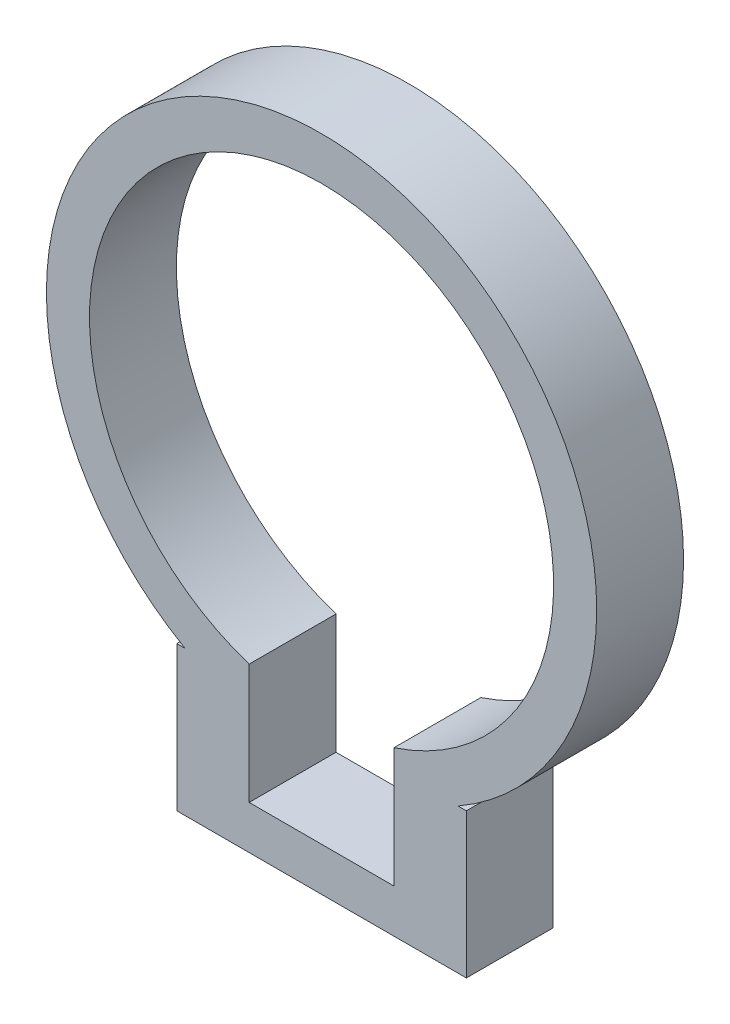
ISO-10303-21;
HEADER;
FILE_DESCRIPTION(('STEP AP214'),'2;1');
FILE_NAME('part.step','',(''),(''),'','','');
FILE_SCHEMA(('AUTOMOTIVE_DESIGN { 1 0 10303 214 1 1 1 1 }'));
ENDSEC;
DATA;
#1=APPLICATION_CONTEXT('core data for automotive mechanical design processes');
#2=APPLICATION_PROTOCOL_DEFINITION('international standard','automotive_design',2000,#1);
#3=PRODUCT_CONTEXT('',#1,'mechanical');
#4=PRODUCT('Part','Part','',(#3));
#5=PRODUCT_RELATED_PRODUCT_CATEGORY('part','',(#4));
#6=PRODUCT_DEFINITION_FORMATION('','',#4);
#7=PRODUCT_DEFINITION_CONTEXT('part definition',#1,'design');
#8=PRODUCT_DEFINITION('design','',#6,#7);
#9=PRODUCT_DEFINITION_SHAPE('','',#8);
#10=(LENGTH_UNIT() NAMED_UNIT(*) SI_UNIT(.MILLI.,.METRE.));
#11=(NAMED_UNIT(*) PLANE_ANGLE_UNIT() SI_UNIT($,.RADIAN.));
#12=(NAMED_UNIT(*) SI_UNIT($,.STERADIAN.) SOLID_ANGLE_UNIT());
#13=UNCERTAINTY_MEASURE_WITH_UNIT(LENGTH_MEASURE(1.E-05),#10,'distance_accuracy_value','');
#14=(GEOMETRIC_REPRESENTATION_CONTEXT(3) GLOBAL_UNCERTAINTY_ASSIGNED_CONTEXT((#13)) GLOBAL_UNIT_ASSIGNED_CONTEXT((#10,
#11,#12)) REPRESENTATION_CONTEXT('',''));
#15=CARTESIAN_POINT('',(0.,0.,0.));
#16=DIRECTION('',(0.,0.,1.));
#17=DIRECTION('',(1.,0.,0.));
#18=AXIS2_PLACEMENT_3D('',#15,#16,#17);
#19=CARTESIAN_POINT('',(9.99999999999997,5.,6.));
#20=DIRECTION('',(0.,-1.,0.));
#21=DIRECTION('',(1.,0.,0.));
#22=AXIS2_PLACEMENT_3D('',#19,#20,#21);
#23=PLANE('',#22);
#24=DIRECTION('',(-1.,0.,0.));
#25=VECTOR('',#24,1.);
#26=CARTESIAN_POINT('',(9.99999999999997,5.,0.));
#27=LINE('',#26,#25);
#28=CARTESIAN_POINT('',(9.99999999999997,5.,0.));
#29=VERTEX_POINT('',#28);
#30=CARTESIAN_POINT('',(9.42529845440799,5.,0.));
#31=VERTEX_POINT('',#30);
#32=EDGE_CURVE('E157',#29,#31,#27,.T.);
#33=ORIENTED_EDGE('',*,*,#32,.T.);
#34=DIRECTION('',(0.,0.,1.));
#35=VECTOR('',#34,1.);
#36=CARTESIAN_POINT('',(9.42529845440799,5.,0.));
#37=LINE('',#36,#35);
#38=CARTESIAN_POINT('',(9.42529845440799,5.,6.));
#39=VERTEX_POINT('',#38);
#40=EDGE_CURVE('E149',#31,#39,#37,.T.);
#41=ORIENTED_EDGE('',*,*,#40,.T.);
#42=DIRECTION('',(-1.,0.,0.));
#43=VECTOR('',#42,1.);
#44=CARTESIAN_POINT('',(9.99999999999997,5.,6.));
#45=LINE('',#44,#43);
#46=CARTESIAN_POINT('',(9.99999999999997,5.,6.));
#47=VERTEX_POINT('',#46);
#48=EDGE_CURVE('E162',#47,#39,#45,.T.);
#49=ORIENTED_EDGE('',*,*,#48,.F.);
#50=DIRECTION('',(0.,0.,-1.));
#51=VECTOR('',#50,1.);
#52=CARTESIAN_POINT('',(9.99999999999997,5.,6.));
#53=LINE('',#52,#51);
#54=EDGE_CURVE('E176',#47,#29,#53,.T.);
#55=ORIENTED_EDGE('',*,*,#54,.T.);
#56=EDGE_LOOP('',(#33,#41,#49,#55));
#57=FACE_BOUND('',#56,.T.);
#58=ADVANCED_FACE('F33',(#57),#23,.F.);
#59=CARTESIAN_POINT('',(-10.,-5.,6.));
#60=DIRECTION('',(1.,0.,0.));
#61=DIRECTION('',(0.,0.,-1.));
#62=AXIS2_PLACEMENT_3D('',#59,#60,#61);
#63=PLANE('',#62);
#64=DIRECTION('',(0.,-1.,0.));
#65=VECTOR('',#64,1.);
#66=CARTESIAN_POINT('',(-10.,-5.,0.));
#67=LINE('',#66,#65);
#68=CARTESIAN_POINT('',(-10.,5.,0.));
#69=VERTEX_POINT('',#68);
#70=CARTESIAN_POINT('',(-10.,-5.,0.));
#71=VERTEX_POINT('',#70);
#72=EDGE_CURVE('E152',#69,#71,#67,.T.);
#73=ORIENTED_EDGE('',*,*,#72,.T.);
#74=DIRECTION('',(0.,0.,-1.));
#75=VECTOR('',#74,1.);
#76=CARTESIAN_POINT('',(-10.,-5.,6.));
#77=LINE('',#76,#75);
#78=CARTESIAN_POINT('',(-10.,-5.,6.));
#79=VERTEX_POINT('',#78);
#80=EDGE_CURVE('E182',#79,#71,#77,.T.);
#81=ORIENTED_EDGE('',*,*,#80,.F.);
#82=DIRECTION('',(0.,-1.,0.));
#83=VECTOR('',#82,1.);
#84=CARTESIAN_POINT('',(-10.,-5.,6.));
#85=LINE('',#84,#83);
#86=CARTESIAN_POINT('',(-10.,5.,6.));
#87=VERTEX_POINT('',#86);
#88=EDGE_CURVE('E153',#87,#79,#85,.T.);
#89=ORIENTED_EDGE('',*,*,#88,.F.);
#90=DIRECTION('',(0.,0.,-1.));
#91=VECTOR('',#90,1.);
#92=CARTESIAN_POINT('',(-10.,5.,6.));
#93=LINE('',#92,#91);
#94=EDGE_CURVE('E164',#87,#69,#93,.T.);
#95=ORIENTED_EDGE('',*,*,#94,.T.);
#96=EDGE_LOOP('',(#73,#81,#89,#95));
#97=FACE_BOUND('',#96,.T.);
#98=ADVANCED_FACE('F35',(#97),#63,.F.);
#99=CARTESIAN_POINT('',(9.99999999999997,-5.,6.));
#100=DIRECTION('',(0.,1.,0.));
#101=DIRECTION('',(-1.,0.,0.));
#102=AXIS2_PLACEMENT_3D('',#99,#100,#101);
#103=PLANE('',#102);
#104=DIRECTION('',(1.,0.,0.));
#105=VECTOR('',#104,1.);
#106=CARTESIAN_POINT('',(9.99999999999997,-5.,0.));
#107=LINE('',#106,#105);
#108=CARTESIAN_POINT('',(9.99999999999997,-5.,0.));
#109=VERTEX_POINT('',#108);
#110=EDGE_CURVE('E167',#71,#109,#107,.T.);
#111=ORIENTED_EDGE('',*,*,#110,.T.);
#112=DIRECTION('',(0.,0.,-1.));
#113=VECTOR('',#112,1.);
#114=CARTESIAN_POINT('',(9.99999999999997,-5.,6.));
#115=LINE('',#114,#113);
#116=CARTESIAN_POINT('',(9.99999999999997,-5.,6.));
#117=VERTEX_POINT('',#116);
#118=EDGE_CURVE('E179',#117,#109,#115,.T.);
#119=ORIENTED_EDGE('',*,*,#118,.F.);
#120=DIRECTION('',(1.,0.,0.));
#121=VECTOR('',#120,1.);
#122=CARTESIAN_POINT('',(9.99999999999997,-5.,6.));
#123=LINE('',#122,#121);
#124=EDGE_CURVE('E156',#79,#117,#123,.T.);
#125=ORIENTED_EDGE('',*,*,#124,.F.);
#126=ORIENTED_EDGE('',*,*,#80,.T.);
#127=EDGE_LOOP('',(#111,#119,#125,#126));
#128=FACE_BOUND('',#127,.T.);
#129=ADVANCED_FACE('F207',(#128),#103,.F.);
#130=CARTESIAN_POINT('',(9.99999999999997,-5.,6.));
#131=DIRECTION('',(-1.,0.,0.));
#132=DIRECTION('',(0.,0.,1.));
#133=AXIS2_PLACEMENT_3D('',#130,#131,#132);
#134=PLANE('',#133);
#135=DIRECTION('',(0.,1.,0.));
#136=VECTOR('',#135,1.);
#137=CARTESIAN_POINT('',(9.99999999999997,-5.,0.));
#138=LINE('',#137,#136);
#139=EDGE_CURVE('E169',#109,#29,#138,.T.);
#140=ORIENTED_EDGE('',*,*,#139,.T.);
#141=ORIENTED_EDGE('',*,*,#54,.F.);
#142=DIRECTION('',(0.,1.,0.));
#143=VECTOR('',#142,1.);
#144=CARTESIAN_POINT('',(9.99999999999997,-5.,6.));
#145=LINE('',#144,#143);
#146=EDGE_CURVE('E159',#117,#47,#145,.T.);
#147=ORIENTED_EDGE('',*,*,#146,.F.);
#148=ORIENTED_EDGE('',*,*,#118,.T.);
#149=EDGE_LOOP('',(#140,#141,#147,#148));
#150=FACE_BOUND('',#149,.T.);
#151=ADVANCED_FACE('F212',(#150),#134,.F.);
#152=CARTESIAN_POINT('',(-9.42529845440803,5.,6.));
#153=VERTEX_POINT('',#152);
#154=EDGE_CURVE('E161',#153,#87,#45,.T.);
#155=ORIENTED_EDGE('',*,*,#154,.F.);
#156=DIRECTION('',(0.,0.,1.));
#157=VECTOR('',#156,1.);
#158=CARTESIAN_POINT('',(-9.42529845440803,5.,0.));
#159=LINE('',#158,#157);
#160=CARTESIAN_POINT('',(-9.42529845440803,5.,0.));
#161=VERTEX_POINT('',#160);
#162=EDGE_CURVE('E145',#153,#161,#159,.F.);
#163=ORIENTED_EDGE('',*,*,#162,.T.);
#164=EDGE_CURVE('E171',#161,#69,#27,.T.);
#165=ORIENTED_EDGE('',*,*,#164,.T.);
#166=ORIENTED_EDGE('',*,*,#94,.F.);
#167=EDGE_LOOP('',(#155,#163,#165,#166));
#168=FACE_BOUND('',#167,.T.);
#169=ADVANCED_FACE('F203',(#168),#23,.F.);
#170=CARTESIAN_POINT('',(0.,0.,6.));
#171=DIRECTION('',(0.,0.,1.));
#172=DIRECTION('',(1.,0.,0.));
#173=AXIS2_PLACEMENT_3D('',#170,#171,#172);
#174=PLANE('',#173);
#175=DIRECTION('',(0.,-1.,0.));
#176=VECTOR('',#175,1.);
#177=CARTESIAN_POINT('',(-5.00000000000002,6.27238612766683,6.));
#178=LINE('',#177,#176);
#179=CARTESIAN_POINT('',(-5.00000000000002,6.27238612766683,6.));
#180=VERTEX_POINT('',#179);
#181=CARTESIAN_POINT('',(-5.00000000000002,-2.,6.));
#182=VERTEX_POINT('',#181);
#183=EDGE_CURVE('E121',#180,#182,#178,.T.);
#184=ORIENTED_EDGE('',*,*,#183,.F.);
#185=CARTESIAN_POINT('',(0.,21.4973861276668,6.));
#186=DIRECTION('',(0.,0.,1.));
#187=DIRECTION('',(1.,0.,0.));
#188=AXIS2_PLACEMENT_3D('',#185,#186,#187);
#189=CIRCLE('',#188,16.025);
#190=CARTESIAN_POINT('',(4.99999999999997,6.27238612766683,6.));
#191=VERTEX_POINT('',#190);
#192=EDGE_CURVE('E138',#191,#180,#189,.T.);
#193=ORIENTED_EDGE('',*,*,#192,.F.);
#194=DIRECTION('',(0.,1.,0.));
#195=VECTOR('',#194,1.);
#196=CARTESIAN_POINT('',(4.99999999999997,6.27238612766683,6.));
#197=LINE('',#196,#195);
#198=CARTESIAN_POINT('',(4.99999999999998,-2.,6.));
#199=VERTEX_POINT('',#198);
#200=EDGE_CURVE('E48',#199,#191,#197,.T.);
#201=ORIENTED_EDGE('',*,*,#200,.F.);
#202=DIRECTION('',(1.,0.,0.));
#203=VECTOR('',#202,1.);
#204=CARTESIAN_POINT('',(-5.00000000000002,-2.,6.));
#205=LINE('',#204,#203);
#206=EDGE_CURVE('E115',#182,#199,#205,.T.);
#207=ORIENTED_EDGE('',*,*,#206,.F.);
#208=EDGE_LOOP('',(#184,#193,#201,#207));
#209=FACE_BOUND('',#208,.T.);
#210=ORIENTED_EDGE('',*,*,#48,.T.);
#211=CARTESIAN_POINT('',(0.,21.4973861276668,6.));
#212=DIRECTION('',(0.,0.,1.));
#213=DIRECTION('',(1.,0.,0.));
#214=AXIS2_PLACEMENT_3D('',#211,#212,#213);
#215=CIRCLE('',#214,19.);
#216=EDGE_CURVE('E56',#39,#153,#215,.T.);
#217=ORIENTED_EDGE('',*,*,#216,.T.);
#218=ORIENTED_EDGE('',*,*,#154,.T.);
#219=ORIENTED_EDGE('',*,*,#88,.T.);
#220=ORIENTED_EDGE('',*,*,#124,.T.);
#221=ORIENTED_EDGE('',*,*,#146,.T.);
#222=EDGE_LOOP('',(#210,#217,#218,#219,#220,#221));
#223=FACE_BOUND('',#222,.T.);
#224=ADVANCED_FACE('F128',(#209,#223),#174,.T.);
#225=CARTESIAN_POINT('',(0.,0.,0.));
#226=DIRECTION('',(0.,0.,1.));
#227=DIRECTION('',(1.,0.,0.));
#228=AXIS2_PLACEMENT_3D('',#225,#226,#227);
#229=PLANE('',#228);
#230=CARTESIAN_POINT('',(0.,21.4973861276668,0.));
#231=DIRECTION('',(0.,0.,1.));
#232=DIRECTION('',(1.,0.,0.));
#233=AXIS2_PLACEMENT_3D('',#230,#231,#232);
#234=CIRCLE('',#233,16.025);
#235=CARTESIAN_POINT('',(4.99999999999997,6.27238612766683,0.));
#236=VERTEX_POINT('',#235);
#237=CARTESIAN_POINT('',(-5.00000000000002,6.27238612766683,0.));
#238=VERTEX_POINT('',#237);
#239=EDGE_CURVE('E139',#236,#238,#234,.T.);
#240=ORIENTED_EDGE('',*,*,#239,.T.);
#241=DIRECTION('',(0.,-1.,0.));
#242=VECTOR('',#241,1.);
#243=CARTESIAN_POINT('',(-5.00000000000002,0.,0.));
#244=LINE('',#243,#242);
#245=CARTESIAN_POINT('',(-5.00000000000002,-2.,0.));
#246=VERTEX_POINT('',#245);
#247=EDGE_CURVE('E136',#238,#246,#244,.T.);
#248=ORIENTED_EDGE('',*,*,#247,.T.);
#249=DIRECTION('',(1.,0.,0.));
#250=VECTOR('',#249,1.);
#251=CARTESIAN_POINT('',(0.,-2.,0.));
#252=LINE('',#251,#250);
#253=CARTESIAN_POINT('',(4.99999999999998,-2.,0.));
#254=VERTEX_POINT('',#253);
#255=EDGE_CURVE('E11',#246,#254,#252,.T.);
#256=ORIENTED_EDGE('',*,*,#255,.T.);
#257=DIRECTION('',(0.,1.,0.));
#258=VECTOR('',#257,1.);
#259=CARTESIAN_POINT('',(4.99999999999998,0.,0.));
#260=LINE('',#259,#258);
#261=EDGE_CURVE('E132',#254,#236,#260,.T.);
#262=ORIENTED_EDGE('',*,*,#261,.T.);
#263=EDGE_LOOP('',(#240,#248,#256,#262));
#264=FACE_BOUND('',#263,.T.);
#265=ORIENTED_EDGE('',*,*,#164,.F.);
#266=CARTESIAN_POINT('',(0.,21.4973861276668,0.));
#267=DIRECTION('',(0.,0.,1.));
#268=DIRECTION('',(1.,0.,0.));
#269=AXIS2_PLACEMENT_3D('',#266,#267,#268);
#270=CIRCLE('',#269,19.);
#271=EDGE_CURVE('E143',#31,#161,#270,.T.);
#272=ORIENTED_EDGE('',*,*,#271,.F.);
#273=ORIENTED_EDGE('',*,*,#32,.F.);
#274=ORIENTED_EDGE('',*,*,#139,.F.);
#275=ORIENTED_EDGE('',*,*,#110,.F.);
#276=ORIENTED_EDGE('',*,*,#72,.F.);
#277=EDGE_LOOP('',(#265,#272,#273,#274,#275,#276));
#278=FACE_BOUND('',#277,.T.);
#279=ADVANCED_FACE('F190',(#264,#278),#229,.F.);
#280=CARTESIAN_POINT('',(0.,21.4973861276668,0.));
#281=DIRECTION('',(0.,0.,1.));
#282=DIRECTION('',(1.,0.,0.));
#283=AXIS2_PLACEMENT_3D('',#280,#281,#282);
#284=CYLINDRICAL_SURFACE('',#283,19.);
#285=ORIENTED_EDGE('',*,*,#40,.F.);
#286=ORIENTED_EDGE('',*,*,#271,.T.);
#287=ORIENTED_EDGE('',*,*,#162,.F.);
#288=ORIENTED_EDGE('',*,*,#216,.F.);
#289=EDGE_LOOP('',(#285,#286,#287,#288));
#290=FACE_BOUND('',#289,.T.);
#291=ADVANCED_FACE('F235',(#290),#284,.T.);
#292=CARTESIAN_POINT('',(0.,21.4973861276668,0.));
#293=DIRECTION('',(0.,0.,1.));
#294=DIRECTION('',(1.,0.,0.));
#295=AXIS2_PLACEMENT_3D('',#292,#293,#294);
#296=CYLINDRICAL_SURFACE('',#295,16.025);
#297=ORIENTED_EDGE('',*,*,#192,.T.);
#298=DIRECTION('',(0.,0.,1.));
#299=VECTOR('',#298,1.);
#300=CARTESIAN_POINT('',(-5.00000000000001,6.27238612766683,0.));
#301=LINE('',#300,#299);
#302=EDGE_CURVE('E41',#180,#238,#301,.F.);
#303=ORIENTED_EDGE('',*,*,#302,.T.);
#304=ORIENTED_EDGE('',*,*,#239,.F.);
#305=DIRECTION('',(0.,0.,1.));
#306=VECTOR('',#305,1.);
#307=CARTESIAN_POINT('',(4.99999999999997,6.27238612766683,0.));
#308=LINE('',#307,#306);
#309=EDGE_CURVE('E185',#236,#191,#308,.T.);
#310=ORIENTED_EDGE('',*,*,#309,.T.);
#311=EDGE_LOOP('',(#297,#303,#304,#310));
#312=FACE_BOUND('',#311,.T.);
#313=ADVANCED_FACE('F188',(#312),#296,.F.);
#314=CARTESIAN_POINT('',(-5.00000000000002,-2.,-4.));
#315=DIRECTION('',(0.,-1.,0.));
#316=DIRECTION('',(0.,0.,-1.));
#317=AXIS2_PLACEMENT_3D('',#314,#315,#316);
#318=PLANE('',#317);
#319=DIRECTION('',(0.,0.,1.));
#320=VECTOR('',#319,1.);
#321=CARTESIAN_POINT('',(-5.00000000000002,-2.,-4.));
#322=LINE('',#321,#320);
#323=EDGE_CURVE('E110',#246,#182,#322,.T.);
#324=ORIENTED_EDGE('',*,*,#323,.T.);
#325=ORIENTED_EDGE('',*,*,#206,.T.);
#326=DIRECTION('',(0.,0.,1.));
#327=VECTOR('',#326,1.);
#328=CARTESIAN_POINT('',(4.99999999999998,-2.,-4.));
#329=LINE('',#328,#327);
#330=EDGE_CURVE('E118',#254,#199,#329,.T.);
#331=ORIENTED_EDGE('',*,*,#330,.F.);
#332=ORIENTED_EDGE('',*,*,#255,.F.);
#333=EDGE_LOOP('',(#324,#325,#331,#332));
#334=FACE_BOUND('',#333,.T.);
#335=ADVANCED_FACE('F112',(#334),#318,.F.);
#336=CARTESIAN_POINT('',(-5.00000000000002,6.27238612766683,-4.));
#337=DIRECTION('',(-1.,0.,0.));
#338=DIRECTION('',(0.,-1.,0.));
#339=AXIS2_PLACEMENT_3D('',#336,#337,#338);
#340=PLANE('',#339);
#341=ORIENTED_EDGE('',*,*,#302,.F.);
#342=ORIENTED_EDGE('',*,*,#183,.T.);
#343=ORIENTED_EDGE('',*,*,#323,.F.);
#344=ORIENTED_EDGE('',*,*,#247,.F.);
#345=EDGE_LOOP('',(#341,#342,#343,#344));
#346=FACE_BOUND('',#345,.T.);
#347=ADVANCED_FACE('F122',(#346),#340,.F.);
#348=CARTESIAN_POINT('',(4.99999999999997,6.27238612766683,-4.));
#349=DIRECTION('',(1.,0.,0.));
#350=DIRECTION('',(0.,1.,0.));
#351=AXIS2_PLACEMENT_3D('',#348,#349,#350);
#352=PLANE('',#351);
#353=ORIENTED_EDGE('',*,*,#330,.T.);
#354=ORIENTED_EDGE('',*,*,#200,.T.);
#355=ORIENTED_EDGE('',*,*,#309,.F.);
#356=ORIENTED_EDGE('',*,*,#261,.F.);
#357=EDGE_LOOP('',(#353,#354,#355,#356));
#358=FACE_BOUND('',#357,.T.);
#359=ADVANCED_FACE('F192',(#358),#352,.F.);
#360=CLOSED_SHELL('',(#58,#98,#129,#151,#169,#224,#279,#291,#313,#335,#347,#359));
#361=MANIFOLD_SOLID_BREP('B2',#360);
#362=ADVANCED_BREP_SHAPE_REPRESENTATION('',(#18,#361),#14);
#363=SHAPE_DEFINITION_REPRESENTATION(#9,#362);
ENDSEC;
END-ISO-10303-21;
